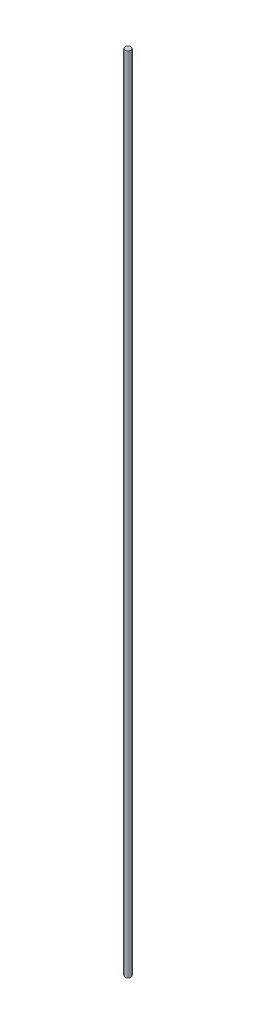
ISO-10303-21;
HEADER;
FILE_DESCRIPTION(('STEP AP214'),'2;1');
FILE_NAME('part.step','',(''),(''),'','','');
FILE_SCHEMA(('AUTOMOTIVE_DESIGN { 1 0 10303 214 1 1 1 1 }'));
ENDSEC;
DATA;
#1=APPLICATION_CONTEXT('core data for automotive mechanical design processes');
#2=APPLICATION_PROTOCOL_DEFINITION('international standard','automotive_design',2000,#1);
#3=PRODUCT_CONTEXT('',#1,'mechanical');
#4=PRODUCT('Part','Part','',(#3));
#5=PRODUCT_RELATED_PRODUCT_CATEGORY('part','',(#4));
#6=PRODUCT_DEFINITION_FORMATION('','',#4);
#7=PRODUCT_DEFINITION_CONTEXT('part definition',#1,'design');
#8=PRODUCT_DEFINITION('design','',#6,#7);
#9=PRODUCT_DEFINITION_SHAPE('','',#8);
#10=(LENGTH_UNIT() NAMED_UNIT(*) SI_UNIT(.MILLI.,.METRE.));
#11=(NAMED_UNIT(*) PLANE_ANGLE_UNIT() SI_UNIT($,.RADIAN.));
#12=(NAMED_UNIT(*) SI_UNIT($,.STERADIAN.) SOLID_ANGLE_UNIT());
#13=UNCERTAINTY_MEASURE_WITH_UNIT(LENGTH_MEASURE(1.E-05),#10,'distance_accuracy_value','');
#14=(GEOMETRIC_REPRESENTATION_CONTEXT(3) GLOBAL_UNCERTAINTY_ASSIGNED_CONTEXT((#13)) GLOBAL_UNIT_ASSIGNED_CONTEXT((#10,
#11,#12)) REPRESENTATION_CONTEXT('',''));
#15=CARTESIAN_POINT('',(0.,0.,0.));
#16=DIRECTION('',(0.,0.,1.));
#17=DIRECTION('',(1.,0.,0.));
#18=AXIS2_PLACEMENT_3D('',#15,#16,#17);
#19=CARTESIAN_POINT('',(0.,4000.,0.));
#20=DIRECTION('',(0.,-1.,0.));
#21=DIRECTION('',(0.,0.,-1.));
#22=AXIS2_PLACEMENT_3D('',#19,#20,#21);
#23=CYLINDRICAL_SURFACE('',#22,15.);
#24=CARTESIAN_POINT('',(0.,4000.,0.));
#25=DIRECTION('',(0.,1.,0.));
#26=DIRECTION('',(0.,0.,1.));
#27=AXIS2_PLACEMENT_3D('',#24,#25,#26);
#28=CIRCLE('',#27,15.);
#29=CARTESIAN_POINT('',(0.,4000.,15.));
#30=VERTEX_POINT('',#29);
#31=EDGE_CURVE('E10',#30,#30,#28,.T.);
#32=ORIENTED_EDGE('',*,*,#31,.F.);
#33=EDGE_LOOP('',(#32));
#34=FACE_BOUND('',#33,.T.);
#35=CARTESIAN_POINT('',(0.,0.,0.));
#36=DIRECTION('',(0.,1.,0.));
#37=DIRECTION('',(0.,0.,1.));
#38=AXIS2_PLACEMENT_3D('',#35,#36,#37);
#39=CIRCLE('',#38,15.);
#40=CARTESIAN_POINT('',(0.,0.,15.));
#41=VERTEX_POINT('',#40);
#42=EDGE_CURVE('E34',#41,#41,#39,.T.);
#43=ORIENTED_EDGE('',*,*,#42,.T.);
#44=EDGE_LOOP('',(#43));
#45=FACE_BOUND('',#44,.T.);
#46=ADVANCED_FACE('F31',(#34,#45),#23,.T.);
#47=CARTESIAN_POINT('',(0.,4000.,0.));
#48=DIRECTION('',(0.,1.,0.));
#49=DIRECTION('',(0.,0.,1.));
#50=AXIS2_PLACEMENT_3D('',#47,#48,#49);
#51=PLANE('',#50);
#52=ORIENTED_EDGE('',*,*,#31,.T.);
#53=EDGE_LOOP('',(#52));
#54=FACE_BOUND('',#53,.T.);
#55=ADVANCED_FACE('F46',(#54),#51,.T.);
#56=CARTESIAN_POINT('',(0.,0.,0.));
#57=DIRECTION('',(0.,1.,0.));
#58=DIRECTION('',(0.,0.,1.));
#59=AXIS2_PLACEMENT_3D('',#56,#57,#58);
#60=PLANE('',#59);
#61=ORIENTED_EDGE('',*,*,#42,.F.);
#62=EDGE_LOOP('',(#61));
#63=FACE_BOUND('',#62,.T.);
#64=ADVANCED_FACE('F44',(#63),#60,.F.);
#65=CLOSED_SHELL('',(#46,#55,#64));
#66=MANIFOLD_SOLID_BREP('B2',#65);
#67=ADVANCED_BREP_SHAPE_REPRESENTATION('',(#18,#66),#14);
#68=SHAPE_DEFINITION_REPRESENTATION(#9,#67);
ENDSEC;
END-ISO-10303-21;
